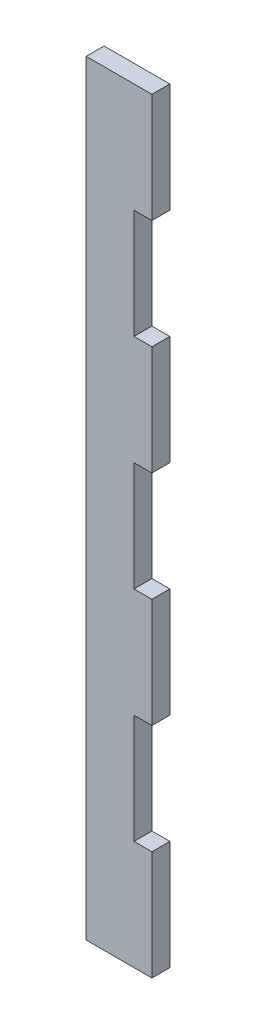
ISO-10303-21;
HEADER;
FILE_DESCRIPTION(('STEP AP214'),'2;1');
FILE_NAME('part.step','',(''),(''),'','','');
FILE_SCHEMA(('AUTOMOTIVE_DESIGN { 1 0 10303 214 1 1 1 1 }'));
ENDSEC;
DATA;
#1=APPLICATION_CONTEXT('core data for automotive mechanical design processes');
#2=APPLICATION_PROTOCOL_DEFINITION('international standard','automotive_design',2000,#1);
#3=PRODUCT_CONTEXT('',#1,'mechanical');
#4=PRODUCT('Part','Part','',(#3));
#5=PRODUCT_RELATED_PRODUCT_CATEGORY('part','',(#4));
#6=PRODUCT_DEFINITION_FORMATION('','',#4);
#7=PRODUCT_DEFINITION_CONTEXT('part definition',#1,'design');
#8=PRODUCT_DEFINITION('design','',#6,#7);
#9=PRODUCT_DEFINITION_SHAPE('','',#8);
#10=(LENGTH_UNIT() NAMED_UNIT(*) SI_UNIT(.MILLI.,.METRE.));
#11=(NAMED_UNIT(*) PLANE_ANGLE_UNIT() SI_UNIT($,.RADIAN.));
#12=(NAMED_UNIT(*) SI_UNIT($,.STERADIAN.) SOLID_ANGLE_UNIT());
#13=UNCERTAINTY_MEASURE_WITH_UNIT(LENGTH_MEASURE(1.E-05),#10,'distance_accuracy_value','');
#14=(GEOMETRIC_REPRESENTATION_CONTEXT(3) GLOBAL_UNCERTAINTY_ASSIGNED_CONTEXT((#13)) GLOBAL_UNIT_ASSIGNED_CONTEXT((#10,
#11,#12)) REPRESENTATION_CONTEXT('',''));
#15=CARTESIAN_POINT('',(0.,0.,0.));
#16=DIRECTION('',(0.,0.,1.));
#17=DIRECTION('',(1.,0.,0.));
#18=AXIS2_PLACEMENT_3D('',#15,#16,#17);
#19=CARTESIAN_POINT('',(0.,-101.6,4.7625));
#20=DIRECTION('',(0.,1.,0.));
#21=DIRECTION('',(0.,0.,1.));
#22=AXIS2_PLACEMENT_3D('',#19,#20,#21);
#23=PLANE('',#22);
#24=DIRECTION('',(1.,0.,0.));
#25=VECTOR('',#24,1.);
#26=CARTESIAN_POINT('',(0.,-101.6,0.));
#27=LINE('',#26,#25);
#28=CARTESIAN_POINT('',(-6.35,-101.6,0.));
#29=VERTEX_POINT('',#28);
#30=CARTESIAN_POINT('',(11.1125000000018,-101.6,0.));
#31=VERTEX_POINT('',#30);
#32=EDGE_CURVE('E177',#29,#31,#27,.T.);
#33=ORIENTED_EDGE('',*,*,#32,.T.);
#34=DIRECTION('',(0.,0.,-1.));
#35=VECTOR('',#34,1.);
#36=CARTESIAN_POINT('',(11.1125000000018,-101.6,4.7625));
#37=LINE('',#36,#35);
#38=CARTESIAN_POINT('',(11.1125000000018,-101.6,4.7625));
#39=VERTEX_POINT('',#38);
#40=EDGE_CURVE('E11',#39,#31,#37,.T.);
#41=ORIENTED_EDGE('',*,*,#40,.F.);
#42=DIRECTION('',(1.,0.,0.));
#43=VECTOR('',#42,1.);
#44=CARTESIAN_POINT('',(0.,-101.6,4.7625));
#45=LINE('',#44,#43);
#46=CARTESIAN_POINT('',(-6.35,-101.6,4.7625));
#47=VERTEX_POINT('',#46);
#48=EDGE_CURVE('E111',#47,#39,#45,.T.);
#49=ORIENTED_EDGE('',*,*,#48,.F.);
#50=DIRECTION('',(0.,0.,-1.));
#51=VECTOR('',#50,1.);
#52=CARTESIAN_POINT('',(-6.35,-101.6,4.7625));
#53=LINE('',#52,#51);
#54=EDGE_CURVE('E173',#47,#29,#53,.T.);
#55=ORIENTED_EDGE('',*,*,#54,.T.);
#56=EDGE_LOOP('',(#33,#41,#49,#55));
#57=FACE_BOUND('',#56,.T.);
#58=ADVANCED_FACE('F35',(#57),#23,.F.);
#59=CARTESIAN_POINT('',(11.1125000000018,0.,4.7625));
#60=DIRECTION('',(1.,0.,0.));
#61=DIRECTION('',(0.,0.,-1.));
#62=AXIS2_PLACEMENT_3D('',#59,#60,#61);
#63=PLANE('',#62);
#64=DIRECTION('',(0.,-1.,0.));
#65=VECTOR('',#64,1.);
#66=CARTESIAN_POINT('',(11.1125000000018,0.,0.));
#67=LINE('',#66,#65);
#68=CARTESIAN_POINT('',(11.1125000000015,-72.5714285714286,0.));
#69=VERTEX_POINT('',#68);
#70=EDGE_CURVE('E180',#69,#31,#67,.T.);
#71=ORIENTED_EDGE('',*,*,#70,.F.);
#72=DIRECTION('',(0.,0.,-1.));
#73=VECTOR('',#72,1.);
#74=CARTESIAN_POINT('',(11.1125000000015,-72.5714285714286,4.7625));
#75=LINE('',#74,#73);
#76=CARTESIAN_POINT('',(11.1125000000015,-72.5714285714286,4.7625));
#77=VERTEX_POINT('',#76);
#78=EDGE_CURVE('E43',#77,#69,#75,.T.);
#79=ORIENTED_EDGE('',*,*,#78,.F.);
#80=DIRECTION('',(0.,-1.,0.));
#81=VECTOR('',#80,1.);
#82=CARTESIAN_POINT('',(11.1125000000018,0.,4.7625));
#83=LINE('',#82,#81);
#84=EDGE_CURVE('E259',#77,#39,#83,.T.);
#85=ORIENTED_EDGE('',*,*,#84,.T.);
#86=ORIENTED_EDGE('',*,*,#40,.T.);
#87=EDGE_LOOP('',(#71,#79,#85,#86));
#88=FACE_BOUND('',#87,.T.);
#89=ADVANCED_FACE('F247',(#88),#63,.T.);
#90=CARTESIAN_POINT('',(0.,-72.5714285714286,4.7625));
#91=DIRECTION('',(0.,1.,0.));
#92=DIRECTION('',(0.,0.,1.));
#93=AXIS2_PLACEMENT_3D('',#90,#91,#92);
#94=PLANE('',#93);
#95=DIRECTION('',(1.,0.,0.));
#96=VECTOR('',#95,1.);
#97=CARTESIAN_POINT('',(0.,-72.5714285714286,0.));
#98=LINE('',#97,#96);
#99=CARTESIAN_POINT('',(6.35,-72.5714285714286,0.));
#100=VERTEX_POINT('',#99);
#101=EDGE_CURVE('E183',#100,#69,#98,.T.);
#102=ORIENTED_EDGE('',*,*,#101,.F.);
#103=DIRECTION('',(0.,0.,-1.));
#104=VECTOR('',#103,1.);
#105=CARTESIAN_POINT('',(6.35,-72.5714285714286,4.7625));
#106=LINE('',#105,#104);
#107=CARTESIAN_POINT('',(6.35,-72.5714285714286,4.7625));
#108=VERTEX_POINT('',#107);
#109=EDGE_CURVE('E237',#108,#100,#106,.T.);
#110=ORIENTED_EDGE('',*,*,#109,.F.);
#111=DIRECTION('',(1.,0.,0.));
#112=VECTOR('',#111,1.);
#113=CARTESIAN_POINT('',(0.,-72.5714285714286,4.7625));
#114=LINE('',#113,#112);
#115=EDGE_CURVE('E244',#108,#77,#114,.T.);
#116=ORIENTED_EDGE('',*,*,#115,.T.);
#117=ORIENTED_EDGE('',*,*,#78,.T.);
#118=EDGE_LOOP('',(#102,#110,#116,#117));
#119=FACE_BOUND('',#118,.T.);
#120=ADVANCED_FACE('F242',(#119),#94,.T.);
#121=CARTESIAN_POINT('',(6.35,0.,4.7625));
#122=DIRECTION('',(1.,0.,0.));
#123=DIRECTION('',(0.,0.,-1.));
#124=AXIS2_PLACEMENT_3D('',#121,#122,#123);
#125=PLANE('',#124);
#126=DIRECTION('',(0.,-1.,0.));
#127=VECTOR('',#126,1.);
#128=CARTESIAN_POINT('',(6.35,0.,0.));
#129=LINE('',#128,#127);
#130=CARTESIAN_POINT('',(6.35,-43.5428571428572,0.));
#131=VERTEX_POINT('',#130);
#132=EDGE_CURVE('E186',#131,#100,#129,.T.);
#133=ORIENTED_EDGE('',*,*,#132,.F.);
#134=DIRECTION('',(0.,0.,-1.));
#135=VECTOR('',#134,1.);
#136=CARTESIAN_POINT('',(6.35,-43.5428571428572,4.7625));
#137=LINE('',#136,#135);
#138=CARTESIAN_POINT('',(6.35,-43.5428571428572,4.7625));
#139=VERTEX_POINT('',#138);
#140=EDGE_CURVE('E235',#139,#131,#137,.T.);
#141=ORIENTED_EDGE('',*,*,#140,.F.);
#142=DIRECTION('',(0.,-1.,0.));
#143=VECTOR('',#142,1.);
#144=CARTESIAN_POINT('',(6.35,0.,4.7625));
#145=LINE('',#144,#143);
#146=EDGE_CURVE('E258',#139,#108,#145,.T.);
#147=ORIENTED_EDGE('',*,*,#146,.T.);
#148=ORIENTED_EDGE('',*,*,#109,.T.);
#149=EDGE_LOOP('',(#133,#141,#147,#148));
#150=FACE_BOUND('',#149,.T.);
#151=ADVANCED_FACE('F254',(#150),#125,.T.);
#152=CARTESIAN_POINT('',(0.,-43.5428571428572,4.7625));
#153=DIRECTION('',(0.,1.,0.));
#154=DIRECTION('',(0.,0.,1.));
#155=AXIS2_PLACEMENT_3D('',#152,#153,#154);
#156=PLANE('',#155);
#157=DIRECTION('',(1.,0.,0.));
#158=VECTOR('',#157,1.);
#159=CARTESIAN_POINT('',(0.,-43.5428571428572,0.));
#160=LINE('',#159,#158);
#161=CARTESIAN_POINT('',(11.1125000000012,-43.5428571428572,0.));
#162=VERTEX_POINT('',#161);
#163=EDGE_CURVE('E189',#131,#162,#160,.T.);
#164=ORIENTED_EDGE('',*,*,#163,.T.);
#165=DIRECTION('',(0.,0.,-1.));
#166=VECTOR('',#165,1.);
#167=CARTESIAN_POINT('',(11.1125000000012,-43.5428571428572,4.7625));
#168=LINE('',#167,#166);
#169=CARTESIAN_POINT('',(11.1125000000012,-43.5428571428572,4.7625));
#170=VERTEX_POINT('',#169);
#171=EDGE_CURVE('E233',#170,#162,#168,.T.);
#172=ORIENTED_EDGE('',*,*,#171,.F.);
#173=DIRECTION('',(1.,0.,0.));
#174=VECTOR('',#173,1.);
#175=CARTESIAN_POINT('',(0.,-43.5428571428572,4.7625));
#176=LINE('',#175,#174);
#177=EDGE_CURVE('E261',#139,#170,#176,.T.);
#178=ORIENTED_EDGE('',*,*,#177,.F.);
#179=ORIENTED_EDGE('',*,*,#140,.T.);
#180=EDGE_LOOP('',(#164,#172,#178,#179));
#181=FACE_BOUND('',#180,.T.);
#182=ADVANCED_FACE('F488',(#181),#156,.F.);
#183=CARTESIAN_POINT('',(11.1125000000012,0.,4.7625));
#184=DIRECTION('',(1.,0.,0.));
#185=DIRECTION('',(0.,0.,-1.));
#186=AXIS2_PLACEMENT_3D('',#183,#184,#185);
#187=PLANE('',#186);
#188=DIRECTION('',(0.,-1.,0.));
#189=VECTOR('',#188,1.);
#190=CARTESIAN_POINT('',(11.1125000000012,0.,0.));
#191=LINE('',#190,#189);
#192=CARTESIAN_POINT('',(11.1125000000009,-14.5142857142858,0.));
#193=VERTEX_POINT('',#192);
#194=EDGE_CURVE('E194',#193,#162,#191,.T.);
#195=ORIENTED_EDGE('',*,*,#194,.F.);
#196=DIRECTION('',(0.,0.,-1.));
#197=VECTOR('',#196,1.);
#198=CARTESIAN_POINT('',(11.1125000000009,-14.5142857142858,4.7625));
#199=LINE('',#198,#197);
#200=CARTESIAN_POINT('',(11.1125000000009,-14.5142857142858,4.7625));
#201=VERTEX_POINT('',#200);
#202=EDGE_CURVE('E231',#201,#193,#199,.T.);
#203=ORIENTED_EDGE('',*,*,#202,.F.);
#204=DIRECTION('',(0.,-1.,0.));
#205=VECTOR('',#204,1.);
#206=CARTESIAN_POINT('',(11.1125000000012,0.,4.7625));
#207=LINE('',#206,#205);
#208=EDGE_CURVE('E269',#201,#170,#207,.T.);
#209=ORIENTED_EDGE('',*,*,#208,.T.);
#210=ORIENTED_EDGE('',*,*,#171,.T.);
#211=EDGE_LOOP('',(#195,#203,#209,#210));
#212=FACE_BOUND('',#211,.T.);
#213=ADVANCED_FACE('F478',(#212),#187,.T.);
#214=CARTESIAN_POINT('',(0.,-14.5142857142858,4.7625));
#215=DIRECTION('',(0.,1.,0.));
#216=DIRECTION('',(0.,0.,1.));
#217=AXIS2_PLACEMENT_3D('',#214,#215,#216);
#218=PLANE('',#217);
#219=DIRECTION('',(1.,0.,0.));
#220=VECTOR('',#219,1.);
#221=CARTESIAN_POINT('',(0.,-14.5142857142858,0.));
#222=LINE('',#221,#220);
#223=CARTESIAN_POINT('',(6.35,-14.5142857142858,0.));
#224=VERTEX_POINT('',#223);
#225=EDGE_CURVE('E197',#224,#193,#222,.T.);
#226=ORIENTED_EDGE('',*,*,#225,.F.);
#227=DIRECTION('',(0.,0.,-1.));
#228=VECTOR('',#227,1.);
#229=CARTESIAN_POINT('',(6.35,-14.5142857142858,4.7625));
#230=LINE('',#229,#228);
#231=CARTESIAN_POINT('',(6.35,-14.5142857142858,4.7625));
#232=VERTEX_POINT('',#231);
#233=EDGE_CURVE('E229',#232,#224,#230,.T.);
#234=ORIENTED_EDGE('',*,*,#233,.F.);
#235=DIRECTION('',(1.,0.,0.));
#236=VECTOR('',#235,1.);
#237=CARTESIAN_POINT('',(0.,-14.5142857142858,4.7625));
#238=LINE('',#237,#236);
#239=EDGE_CURVE('E272',#232,#201,#238,.T.);
#240=ORIENTED_EDGE('',*,*,#239,.T.);
#241=ORIENTED_EDGE('',*,*,#202,.T.);
#242=EDGE_LOOP('',(#226,#234,#240,#241));
#243=FACE_BOUND('',#242,.T.);
#244=ADVANCED_FACE('F296',(#243),#218,.T.);
#245=CARTESIAN_POINT('',(6.35,14.5142857142857,0.));
#246=VERTEX_POINT('',#245);
#247=EDGE_CURVE('E191',#246,#224,#129,.T.);
#248=ORIENTED_EDGE('',*,*,#247,.F.);
#249=DIRECTION('',(0.,0.,-1.));
#250=VECTOR('',#249,1.);
#251=CARTESIAN_POINT('',(6.35,14.5142857142857,4.7625));
#252=LINE('',#251,#250);
#253=CARTESIAN_POINT('',(6.35,14.5142857142857,4.7625));
#254=VERTEX_POINT('',#253);
#255=EDGE_CURVE('E227',#254,#246,#252,.T.);
#256=ORIENTED_EDGE('',*,*,#255,.F.);
#257=EDGE_CURVE('E264',#254,#232,#145,.T.);
#258=ORIENTED_EDGE('',*,*,#257,.T.);
#259=ORIENTED_EDGE('',*,*,#233,.T.);
#260=EDGE_LOOP('',(#248,#256,#258,#259));
#261=FACE_BOUND('',#260,.T.);
#262=ADVANCED_FACE('F288',(#261),#125,.T.);
#263=CARTESIAN_POINT('',(0.,14.5142857142857,4.7625));
#264=DIRECTION('',(0.,1.,0.));
#265=DIRECTION('',(0.,0.,1.));
#266=AXIS2_PLACEMENT_3D('',#263,#264,#265);
#267=PLANE('',#266);
#268=DIRECTION('',(1.,0.,0.));
#269=VECTOR('',#268,1.);
#270=CARTESIAN_POINT('',(0.,14.5142857142857,0.));
#271=LINE('',#270,#269);
#272=CARTESIAN_POINT('',(11.1125000000006,14.5142857142857,0.));
#273=VERTEX_POINT('',#272);
#274=EDGE_CURVE('E200',#246,#273,#271,.T.);
#275=ORIENTED_EDGE('',*,*,#274,.T.);
#276=DIRECTION('',(0.,0.,-1.));
#277=VECTOR('',#276,1.);
#278=CARTESIAN_POINT('',(11.1125000000006,14.5142857142857,4.7625));
#279=LINE('',#278,#277);
#280=CARTESIAN_POINT('',(11.1125000000006,14.5142857142857,4.7625));
#281=VERTEX_POINT('',#280);
#282=EDGE_CURVE('E225',#281,#273,#279,.T.);
#283=ORIENTED_EDGE('',*,*,#282,.F.);
#284=DIRECTION('',(1.,0.,0.));
#285=VECTOR('',#284,1.);
#286=CARTESIAN_POINT('',(0.,14.5142857142857,4.7625));
#287=LINE('',#286,#285);
#288=EDGE_CURVE('E275',#254,#281,#287,.T.);
#289=ORIENTED_EDGE('',*,*,#288,.F.);
#290=ORIENTED_EDGE('',*,*,#255,.T.);
#291=EDGE_LOOP('',(#275,#283,#289,#290));
#292=FACE_BOUND('',#291,.T.);
#293=ADVANCED_FACE('F312',(#292),#267,.F.);
#294=CARTESIAN_POINT('',(11.1125000000006,0.,4.7625));
#295=DIRECTION('',(1.,0.,0.));
#296=DIRECTION('',(0.,0.,-1.));
#297=AXIS2_PLACEMENT_3D('',#294,#295,#296);
#298=PLANE('',#297);
#299=DIRECTION('',(0.,-1.,0.));
#300=VECTOR('',#299,1.);
#301=CARTESIAN_POINT('',(11.1125000000006,0.,0.));
#302=LINE('',#301,#300);
#303=CARTESIAN_POINT('',(11.1125000000003,43.5428571428571,0.));
#304=VERTEX_POINT('',#303);
#305=EDGE_CURVE('E203',#304,#273,#302,.T.);
#306=ORIENTED_EDGE('',*,*,#305,.F.);
#307=DIRECTION('',(0.,0.,-1.));
#308=VECTOR('',#307,1.);
#309=CARTESIAN_POINT('',(11.1125000000003,43.5428571428571,4.7625));
#310=LINE('',#309,#308);
#311=CARTESIAN_POINT('',(11.1125000000003,43.5428571428571,4.7625));
#312=VERTEX_POINT('',#311);
#313=EDGE_CURVE('E223',#312,#304,#310,.T.);
#314=ORIENTED_EDGE('',*,*,#313,.F.);
#315=DIRECTION('',(0.,-1.,0.));
#316=VECTOR('',#315,1.);
#317=CARTESIAN_POINT('',(11.1125000000006,0.,4.7625));
#318=LINE('',#317,#316);
#319=EDGE_CURVE('E277',#312,#281,#318,.T.);
#320=ORIENTED_EDGE('',*,*,#319,.T.);
#321=ORIENTED_EDGE('',*,*,#282,.T.);
#322=EDGE_LOOP('',(#306,#314,#320,#321));
#323=FACE_BOUND('',#322,.T.);
#324=ADVANCED_FACE('F310',(#323),#298,.T.);
#325=CARTESIAN_POINT('',(0.,43.5428571428571,4.7625));
#326=DIRECTION('',(0.,1.,0.));
#327=DIRECTION('',(0.,0.,1.));
#328=AXIS2_PLACEMENT_3D('',#325,#326,#327);
#329=PLANE('',#328);
#330=DIRECTION('',(1.,0.,0.));
#331=VECTOR('',#330,1.);
#332=CARTESIAN_POINT('',(0.,43.5428571428571,0.));
#333=LINE('',#332,#331);
#334=CARTESIAN_POINT('',(6.35,43.5428571428571,0.));
#335=VERTEX_POINT('',#334);
#336=EDGE_CURVE('E206',#335,#304,#333,.T.);
#337=ORIENTED_EDGE('',*,*,#336,.F.);
#338=DIRECTION('',(0.,0.,-1.));
#339=VECTOR('',#338,1.);
#340=CARTESIAN_POINT('',(6.35,43.5428571428571,4.7625));
#341=LINE('',#340,#339);
#342=CARTESIAN_POINT('',(6.35,43.5428571428571,4.7625));
#343=VERTEX_POINT('',#342);
#344=EDGE_CURVE('E221',#343,#335,#341,.T.);
#345=ORIENTED_EDGE('',*,*,#344,.F.);
#346=DIRECTION('',(1.,0.,0.));
#347=VECTOR('',#346,1.);
#348=CARTESIAN_POINT('',(0.,43.5428571428571,4.7625));
#349=LINE('',#348,#347);
#350=EDGE_CURVE('E280',#343,#312,#349,.T.);
#351=ORIENTED_EDGE('',*,*,#350,.T.);
#352=ORIENTED_EDGE('',*,*,#313,.T.);
#353=EDGE_LOOP('',(#337,#345,#351,#352));
#354=FACE_BOUND('',#353,.T.);
#355=ADVANCED_FACE('F307',(#354),#329,.T.);
#356=CARTESIAN_POINT('',(6.35,72.5714285714285,0.));
#357=VERTEX_POINT('',#356);
#358=EDGE_CURVE('E190',#357,#335,#129,.T.);
#359=ORIENTED_EDGE('',*,*,#358,.F.);
#360=DIRECTION('',(0.,0.,-1.));
#361=VECTOR('',#360,1.);
#362=CARTESIAN_POINT('',(6.35,72.5714285714285,4.7625));
#363=LINE('',#362,#361);
#364=CARTESIAN_POINT('',(6.35,72.5714285714285,4.7625));
#365=VERTEX_POINT('',#364);
#366=EDGE_CURVE('E219',#365,#357,#363,.T.);
#367=ORIENTED_EDGE('',*,*,#366,.F.);
#368=EDGE_CURVE('E263',#365,#343,#145,.T.);
#369=ORIENTED_EDGE('',*,*,#368,.T.);
#370=ORIENTED_EDGE('',*,*,#344,.T.);
#371=EDGE_LOOP('',(#359,#367,#369,#370));
#372=FACE_BOUND('',#371,.T.);
#373=ADVANCED_FACE('F304',(#372),#125,.T.);
#374=CARTESIAN_POINT('',(0.,72.5714285714285,4.7625));
#375=DIRECTION('',(0.,1.,0.));
#376=DIRECTION('',(0.,0.,1.));
#377=AXIS2_PLACEMENT_3D('',#374,#375,#376);
#378=PLANE('',#377);
#379=DIRECTION('',(1.,0.,0.));
#380=VECTOR('',#379,1.);
#381=CARTESIAN_POINT('',(0.,72.5714285714285,0.));
#382=LINE('',#381,#380);
#383=CARTESIAN_POINT('',(11.1125,72.5714285714285,0.));
#384=VERTEX_POINT('',#383);
#385=EDGE_CURVE('E209',#357,#384,#382,.T.);
#386=ORIENTED_EDGE('',*,*,#385,.T.);
#387=DIRECTION('',(0.,0.,-1.));
#388=VECTOR('',#387,1.);
#389=CARTESIAN_POINT('',(11.1125,72.5714285714285,4.7625));
#390=LINE('',#389,#388);
#391=CARTESIAN_POINT('',(11.1125,72.5714285714285,4.7625));
#392=VERTEX_POINT('',#391);
#393=EDGE_CURVE('E162',#392,#384,#390,.T.);
#394=ORIENTED_EDGE('',*,*,#393,.F.);
#395=DIRECTION('',(1.,0.,0.));
#396=VECTOR('',#395,1.);
#397=CARTESIAN_POINT('',(0.,72.5714285714285,4.7625));
#398=LINE('',#397,#396);
#399=EDGE_CURVE('E168',#365,#392,#398,.T.);
#400=ORIENTED_EDGE('',*,*,#399,.F.);
#401=ORIENTED_EDGE('',*,*,#366,.T.);
#402=EDGE_LOOP('',(#386,#394,#400,#401));
#403=FACE_BOUND('',#402,.T.);
#404=ADVANCED_FACE('F340',(#403),#378,.F.);
#405=CARTESIAN_POINT('',(11.1125,0.,4.7625));
#406=DIRECTION('',(1.,0.,0.));
#407=DIRECTION('',(0.,0.,-1.));
#408=AXIS2_PLACEMENT_3D('',#405,#406,#407);
#409=PLANE('',#408);
#410=DIRECTION('',(0.,-1.,0.));
#411=VECTOR('',#410,1.);
#412=CARTESIAN_POINT('',(11.1125,0.,0.));
#413=LINE('',#412,#411);
#414=CARTESIAN_POINT('',(11.1125,101.6,0.));
#415=VERTEX_POINT('',#414);
#416=EDGE_CURVE('E157',#415,#384,#413,.T.);
#417=ORIENTED_EDGE('',*,*,#416,.F.);
#418=DIRECTION('',(0.,0.,-1.));
#419=VECTOR('',#418,1.);
#420=CARTESIAN_POINT('',(11.1125,101.6,4.7625));
#421=LINE('',#420,#419);
#422=CARTESIAN_POINT('',(11.1125,101.6,4.7625));
#423=VERTEX_POINT('',#422);
#424=EDGE_CURVE('E152',#423,#415,#421,.T.);
#425=ORIENTED_EDGE('',*,*,#424,.F.);
#426=DIRECTION('',(0.,-1.,0.));
#427=VECTOR('',#426,1.);
#428=CARTESIAN_POINT('',(11.1125,0.,4.7625));
#429=LINE('',#428,#427);
#430=EDGE_CURVE('E155',#423,#392,#429,.T.);
#431=ORIENTED_EDGE('',*,*,#430,.T.);
#432=ORIENTED_EDGE('',*,*,#393,.T.);
#433=EDGE_LOOP('',(#417,#425,#431,#432));
#434=FACE_BOUND('',#433,.T.);
#435=ADVANCED_FACE('F154',(#434),#409,.T.);
#436=CARTESIAN_POINT('',(0.,101.6,4.7625));
#437=DIRECTION('',(0.,1.,0.));
#438=DIRECTION('',(0.,0.,1.));
#439=AXIS2_PLACEMENT_3D('',#436,#437,#438);
#440=PLANE('',#439);
#441=DIRECTION('',(1.,0.,0.));
#442=VECTOR('',#441,1.);
#443=CARTESIAN_POINT('',(0.,101.6,0.));
#444=LINE('',#443,#442);
#445=CARTESIAN_POINT('',(-6.35,101.6,0.));
#446=VERTEX_POINT('',#445);
#447=EDGE_CURVE('E213',#446,#415,#444,.T.);
#448=ORIENTED_EDGE('',*,*,#447,.F.);
#449=DIRECTION('',(0.,0.,-1.));
#450=VECTOR('',#449,1.);
#451=CARTESIAN_POINT('',(-6.35,101.6,4.7625));
#452=LINE('',#451,#450);
#453=CARTESIAN_POINT('',(-6.35,101.6,4.7625));
#454=VERTEX_POINT('',#453);
#455=EDGE_CURVE('E102',#454,#446,#452,.T.);
#456=ORIENTED_EDGE('',*,*,#455,.F.);
#457=DIRECTION('',(1.,0.,0.));
#458=VECTOR('',#457,1.);
#459=CARTESIAN_POINT('',(0.,101.6,4.7625));
#460=LINE('',#459,#458);
#461=EDGE_CURVE('E165',#454,#423,#460,.T.);
#462=ORIENTED_EDGE('',*,*,#461,.T.);
#463=ORIENTED_EDGE('',*,*,#424,.T.);
#464=EDGE_LOOP('',(#448,#456,#462,#463));
#465=FACE_BOUND('',#464,.T.);
#466=ADVANCED_FACE('F171',(#465),#440,.T.);
#467=CARTESIAN_POINT('',(-6.35,0.,4.7625));
#468=DIRECTION('',(1.,0.,0.));
#469=DIRECTION('',(0.,0.,-1.));
#470=AXIS2_PLACEMENT_3D('',#467,#468,#469);
#471=PLANE('',#470);
#472=DIRECTION('',(0.,-1.,0.));
#473=VECTOR('',#472,1.);
#474=CARTESIAN_POINT('',(-6.35,0.,0.));
#475=LINE('',#474,#473);
#476=EDGE_CURVE('E105',#446,#29,#475,.T.);
#477=ORIENTED_EDGE('',*,*,#476,.T.);
#478=ORIENTED_EDGE('',*,*,#54,.F.);
#479=DIRECTION('',(0.,-1.,0.));
#480=VECTOR('',#479,1.);
#481=CARTESIAN_POINT('',(-6.35,0.,4.7625));
#482=LINE('',#481,#480);
#483=EDGE_CURVE('E51',#454,#47,#482,.T.);
#484=ORIENTED_EDGE('',*,*,#483,.F.);
#485=ORIENTED_EDGE('',*,*,#455,.T.);
#486=EDGE_LOOP('',(#477,#478,#484,#485));
#487=FACE_BOUND('',#486,.T.);
#488=ADVANCED_FACE('F327',(#487),#471,.F.);
#489=CARTESIAN_POINT('',(0.,0.,4.7625));
#490=DIRECTION('',(0.,0.,1.));
#491=DIRECTION('',(1.,0.,0.));
#492=AXIS2_PLACEMENT_3D('',#489,#490,#491);
#493=PLANE('',#492);
#494=ORIENTED_EDGE('',*,*,#48,.T.);
#495=ORIENTED_EDGE('',*,*,#84,.F.);
#496=ORIENTED_EDGE('',*,*,#115,.F.);
#497=ORIENTED_EDGE('',*,*,#146,.F.);
#498=ORIENTED_EDGE('',*,*,#177,.T.);
#499=ORIENTED_EDGE('',*,*,#208,.F.);
#500=ORIENTED_EDGE('',*,*,#239,.F.);
#501=ORIENTED_EDGE('',*,*,#257,.F.);
#502=ORIENTED_EDGE('',*,*,#288,.T.);
#503=ORIENTED_EDGE('',*,*,#319,.F.);
#504=ORIENTED_EDGE('',*,*,#350,.F.);
#505=ORIENTED_EDGE('',*,*,#368,.F.);
#506=ORIENTED_EDGE('',*,*,#399,.T.);
#507=ORIENTED_EDGE('',*,*,#430,.F.);
#508=ORIENTED_EDGE('',*,*,#461,.F.);
#509=ORIENTED_EDGE('',*,*,#483,.T.);
#510=EDGE_LOOP('',(#494,#495,#496,#497,#498,#499,#500,#501,#502,#503,#504,#505,#506,#507,#508,#509));
#511=FACE_BOUND('',#510,.T.);
#512=ADVANCED_FACE('F164',(#511),#493,.T.);
#513=CARTESIAN_POINT('',(0.,0.,0.));
#514=DIRECTION('',(0.,0.,1.));
#515=DIRECTION('',(1.,0.,0.));
#516=AXIS2_PLACEMENT_3D('',#513,#514,#515);
#517=PLANE('',#516);
#518=ORIENTED_EDGE('',*,*,#32,.F.);
#519=ORIENTED_EDGE('',*,*,#476,.F.);
#520=ORIENTED_EDGE('',*,*,#447,.T.);
#521=ORIENTED_EDGE('',*,*,#416,.T.);
#522=ORIENTED_EDGE('',*,*,#385,.F.);
#523=ORIENTED_EDGE('',*,*,#358,.T.);
#524=ORIENTED_EDGE('',*,*,#336,.T.);
#525=ORIENTED_EDGE('',*,*,#305,.T.);
#526=ORIENTED_EDGE('',*,*,#274,.F.);
#527=ORIENTED_EDGE('',*,*,#247,.T.);
#528=ORIENTED_EDGE('',*,*,#225,.T.);
#529=ORIENTED_EDGE('',*,*,#194,.T.);
#530=ORIENTED_EDGE('',*,*,#163,.F.);
#531=ORIENTED_EDGE('',*,*,#132,.T.);
#532=ORIENTED_EDGE('',*,*,#101,.T.);
#533=ORIENTED_EDGE('',*,*,#70,.T.);
#534=EDGE_LOOP('',(#518,#519,#520,#521,#522,#523,#524,#525,#526,#527,#528,#529,#530,#531,#532,#533));
#535=FACE_BOUND('',#534,.T.);
#536=ADVANCED_FACE('F250',(#535),#517,.F.);
#537=CLOSED_SHELL('',(#58,#89,#120,#151,#182,#213,#244,#262,#293,#324,#355,#373,#404,#435,#466,
#488,#512,#536));
#538=MANIFOLD_SOLID_BREP('B2',#537);
#539=ADVANCED_BREP_SHAPE_REPRESENTATION('',(#18,#538),#14);
#540=SHAPE_DEFINITION_REPRESENTATION(#9,#539);
ENDSEC;
END-ISO-10303-21;
